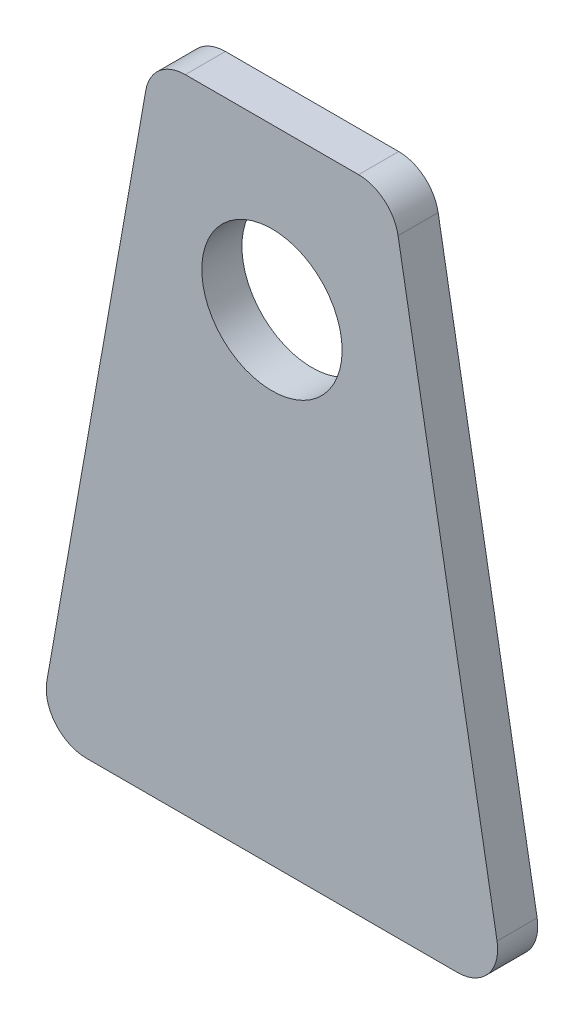
ISO-10303-21;
HEADER;
FILE_DESCRIPTION(('STEP AP214'),'2;1');
FILE_NAME('part.step','',(''),(''),'','','');
FILE_SCHEMA(('AUTOMOTIVE_DESIGN { 1 0 10303 214 1 1 1 1 }'));
ENDSEC;
DATA;
#1=APPLICATION_CONTEXT('core data for automotive mechanical design processes');
#2=APPLICATION_PROTOCOL_DEFINITION('international standard','automotive_design',2000,#1);
#3=PRODUCT_CONTEXT('',#1,'mechanical');
#4=PRODUCT('Part','Part','',(#3));
#5=PRODUCT_RELATED_PRODUCT_CATEGORY('part','',(#4));
#6=PRODUCT_DEFINITION_FORMATION('','',#4);
#7=PRODUCT_DEFINITION_CONTEXT('part definition',#1,'design');
#8=PRODUCT_DEFINITION('design','',#6,#7);
#9=PRODUCT_DEFINITION_SHAPE('','',#8);
#10=(LENGTH_UNIT() NAMED_UNIT(*) SI_UNIT(.MILLI.,.METRE.));
#11=(NAMED_UNIT(*) PLANE_ANGLE_UNIT() SI_UNIT($,.RADIAN.));
#12=(NAMED_UNIT(*) SI_UNIT($,.STERADIAN.) SOLID_ANGLE_UNIT());
#13=UNCERTAINTY_MEASURE_WITH_UNIT(LENGTH_MEASURE(1.E-05),#10,'distance_accuracy_value','');
#14=(GEOMETRIC_REPRESENTATION_CONTEXT(3) GLOBAL_UNCERTAINTY_ASSIGNED_CONTEXT((#13)) GLOBAL_UNIT_ASSIGNED_CONTEXT((#10,
#11,#12)) REPRESENTATION_CONTEXT('',''));
#15=CARTESIAN_POINT('',(0.,0.,0.));
#16=DIRECTION('',(0.,0.,1.));
#17=DIRECTION('',(1.,0.,0.));
#18=AXIS2_PLACEMENT_3D('',#15,#16,#17);
#19=CARTESIAN_POINT('',(66.3620071669862,6.35,6.35));
#20=DIRECTION('',(0.,0.,-1.));
#21=DIRECTION('',(-1.,0.,0.));
#22=AXIS2_PLACEMENT_3D('',#19,#20,#21);
#23=PLANE('',#22);
#24=CARTESIAN_POINT('',(66.3620071669862,6.35,6.35));
#25=DIRECTION('',(0.,0.,1.));
#26=DIRECTION('',(-1.,0.,0.));
#27=AXIS2_PLACEMENT_3D('',#24,#25,#26);
#28=CIRCLE('',#27,6.35);
#29=CARTESIAN_POINT('',(66.3620071669861,0.,6.35));
#30=VERTEX_POINT('',#29);
#31=CARTESIAN_POINT('',(72.6155363986137,7.45266592818504,6.35));
#32=VERTEX_POINT('',#31);
#33=EDGE_CURVE('E148',#30,#32,#28,.T.);
#34=ORIENTED_EDGE('',*,*,#33,.T.);
#35=DIRECTION('',(-0.173648177666927,0.984807753012209,0.));
#36=VECTOR('',#35,1.);
#37=CARTESIAN_POINT('',(56.9400678136315,96.3526659281849,6.35));
#38=LINE('',#37,#36);
#39=CARTESIAN_POINT('',(56.9400678136315,96.3526659281849,6.35));
#40=VERTEX_POINT('',#39);
#41=EDGE_CURVE('E96',#32,#40,#38,.T.);
#42=ORIENTED_EDGE('',*,*,#41,.T.);
#43=CARTESIAN_POINT('',(50.686538582004,95.25,6.35));
#44=DIRECTION('',(0.,0.,1.));
#45=DIRECTION('',(-1.,0.,0.));
#46=AXIS2_PLACEMENT_3D('',#43,#44,#45);
#47=CIRCLE('',#46,6.35);
#48=CARTESIAN_POINT('',(50.6865385820039,101.6,6.35));
#49=VERTEX_POINT('',#48);
#50=EDGE_CURVE('E163',#40,#49,#47,.T.);
#51=ORIENTED_EDGE('',*,*,#50,.T.);
#52=DIRECTION('',(-1.,0.,0.));
#53=VECTOR('',#52,1.);
#54=CARTESIAN_POINT('',(23.2431038979555,101.6,6.35));
#55=LINE('',#54,#53);
#56=CARTESIAN_POINT('',(23.2431038979555,101.6,6.35));
#57=VERTEX_POINT('',#56);
#58=EDGE_CURVE('E176',#49,#57,#55,.T.);
#59=ORIENTED_EDGE('',*,*,#58,.T.);
#60=CARTESIAN_POINT('',(23.2431038979555,95.25,6.35));
#61=DIRECTION('',(0.,0.,1.));
#62=DIRECTION('',(-1.,0.,0.));
#63=AXIS2_PLACEMENT_3D('',#60,#61,#62);
#64=CIRCLE('',#63,6.35);
#65=CARTESIAN_POINT('',(16.9895746663279,96.3526659281849,6.35));
#66=VERTEX_POINT('',#65);
#67=EDGE_CURVE('E115',#57,#66,#64,.T.);
#68=ORIENTED_EDGE('',*,*,#67,.T.);
#69=DIRECTION('',(-0.173648177666927,-0.984807753012209,0.));
#70=VECTOR('',#69,1.);
#71=CARTESIAN_POINT('',(1.31410608134569,7.45266592818504,6.35));
#72=LINE('',#71,#70);
#73=CARTESIAN_POINT('',(1.31410608134569,7.45266592818504,6.35));
#74=VERTEX_POINT('',#73);
#75=EDGE_CURVE('E109',#66,#74,#72,.T.);
#76=ORIENTED_EDGE('',*,*,#75,.T.);
#77=CARTESIAN_POINT('',(7.56763531297321,6.35,6.35));
#78=DIRECTION('',(0.,0.,1.));
#79=DIRECTION('',(1.,0.,0.));
#80=AXIS2_PLACEMENT_3D('',#77,#78,#79);
#81=CIRCLE('',#80,6.35);
#82=CARTESIAN_POINT('',(7.56763531297327,0.,6.35));
#83=VERTEX_POINT('',#82);
#84=EDGE_CURVE('E113',#74,#83,#81,.T.);
#85=ORIENTED_EDGE('',*,*,#84,.T.);
#86=DIRECTION('',(1.,0.,0.));
#87=VECTOR('',#86,1.);
#88=CARTESIAN_POINT('',(7.56763531297327,0.,6.35));
#89=LINE('',#88,#87);
#90=EDGE_CURVE('E53',#83,#30,#89,.T.);
#91=ORIENTED_EDGE('',*,*,#90,.T.);
#92=EDGE_LOOP('',(#34,#42,#51,#59,#68,#76,#85,#91));
#93=FACE_BOUND('',#92,.T.);
#94=CARTESIAN_POINT('',(36.9648212399797,76.2,6.35));
#95=DIRECTION('',(0.,0.,1.));
#96=DIRECTION('',(1.,0.,0.));
#97=AXIS2_PLACEMENT_3D('',#94,#95,#96);
#98=CIRCLE('',#97,11.1125);
#99=CARTESIAN_POINT('',(48.0773212399797,76.2,6.35));
#100=VERTEX_POINT('',#99);
#101=EDGE_CURVE('E137',#100,#100,#98,.T.);
#102=ORIENTED_EDGE('',*,*,#101,.F.);
#103=EDGE_LOOP('',(#102));
#104=FACE_BOUND('',#103,.T.);
#105=ADVANCED_FACE('F36',(#93,#104),#23,.F.);
#106=CARTESIAN_POINT('',(66.3620071669862,6.35,0.));
#107=DIRECTION('',(0.,0.,-1.));
#108=DIRECTION('',(-1.,0.,0.));
#109=AXIS2_PLACEMENT_3D('',#106,#107,#108);
#110=PLANE('',#109);
#111=CARTESIAN_POINT('',(66.3620071669862,6.35,0.));
#112=DIRECTION('',(0.,0.,1.));
#113=DIRECTION('',(-1.,0.,0.));
#114=AXIS2_PLACEMENT_3D('',#111,#112,#113);
#115=CIRCLE('',#114,6.35);
#116=CARTESIAN_POINT('',(66.3620071669861,0.,0.));
#117=VERTEX_POINT('',#116);
#118=CARTESIAN_POINT('',(72.6155363986137,7.45266592818504,0.));
#119=VERTEX_POINT('',#118);
#120=EDGE_CURVE('E133',#117,#119,#115,.T.);
#121=ORIENTED_EDGE('',*,*,#120,.F.);
#122=DIRECTION('',(1.,0.,0.));
#123=VECTOR('',#122,1.);
#124=CARTESIAN_POINT('',(7.56763531297327,0.,0.));
#125=LINE('',#124,#123);
#126=CARTESIAN_POINT('',(7.56763531297327,0.,0.));
#127=VERTEX_POINT('',#126);
#128=EDGE_CURVE('E88',#127,#117,#125,.T.);
#129=ORIENTED_EDGE('',*,*,#128,.F.);
#130=CARTESIAN_POINT('',(7.56763531297321,6.35,0.));
#131=DIRECTION('',(0.,0.,1.));
#132=DIRECTION('',(1.,0.,0.));
#133=AXIS2_PLACEMENT_3D('',#130,#131,#132);
#134=CIRCLE('',#133,6.35);
#135=CARTESIAN_POINT('',(1.31410608134569,7.45266592818504,0.));
#136=VERTEX_POINT('',#135);
#137=EDGE_CURVE('E82',#136,#127,#134,.T.);
#138=ORIENTED_EDGE('',*,*,#137,.F.);
#139=DIRECTION('',(-0.173648177666927,-0.984807753012209,0.));
#140=VECTOR('',#139,1.);
#141=CARTESIAN_POINT('',(1.31410608134569,7.45266592818504,0.));
#142=LINE('',#141,#140);
#143=CARTESIAN_POINT('',(16.9895746663279,96.3526659281849,0.));
#144=VERTEX_POINT('',#143);
#145=EDGE_CURVE('E123',#144,#136,#142,.T.);
#146=ORIENTED_EDGE('',*,*,#145,.F.);
#147=CARTESIAN_POINT('',(23.2431038979555,95.25,0.));
#148=DIRECTION('',(0.,0.,1.));
#149=DIRECTION('',(-1.,0.,0.));
#150=AXIS2_PLACEMENT_3D('',#147,#148,#149);
#151=CIRCLE('',#150,6.35);
#152=CARTESIAN_POINT('',(23.2431038979555,101.6,0.));
#153=VERTEX_POINT('',#152);
#154=EDGE_CURVE('E143',#153,#144,#151,.T.);
#155=ORIENTED_EDGE('',*,*,#154,.F.);
#156=DIRECTION('',(-1.,0.,0.));
#157=VECTOR('',#156,1.);
#158=CARTESIAN_POINT('',(23.2431038979555,101.6,0.));
#159=LINE('',#158,#157);
#160=CARTESIAN_POINT('',(50.6865385820039,101.6,0.));
#161=VERTEX_POINT('',#160);
#162=EDGE_CURVE('E141',#161,#153,#159,.T.);
#163=ORIENTED_EDGE('',*,*,#162,.F.);
#164=CARTESIAN_POINT('',(50.686538582004,95.25,0.));
#165=DIRECTION('',(0.,0.,1.));
#166=DIRECTION('',(-1.,0.,0.));
#167=AXIS2_PLACEMENT_3D('',#164,#165,#166);
#168=CIRCLE('',#167,6.35);
#169=CARTESIAN_POINT('',(56.9400678136315,96.3526659281849,0.));
#170=VERTEX_POINT('',#169);
#171=EDGE_CURVE('E139',#170,#161,#168,.T.);
#172=ORIENTED_EDGE('',*,*,#171,.F.);
#173=DIRECTION('',(-0.173648177666927,0.984807753012209,0.));
#174=VECTOR('',#173,1.);
#175=CARTESIAN_POINT('',(56.9400678136315,96.3526659281849,0.));
#176=LINE('',#175,#174);
#177=EDGE_CURVE('E136',#119,#170,#176,.T.);
#178=ORIENTED_EDGE('',*,*,#177,.F.);
#179=EDGE_LOOP('',(#121,#129,#138,#146,#155,#163,#172,#178));
#180=FACE_BOUND('',#179,.T.);
#181=CARTESIAN_POINT('',(36.9648212399797,76.2,0.));
#182=DIRECTION('',(0.,0.,1.));
#183=DIRECTION('',(1.,0.,0.));
#184=AXIS2_PLACEMENT_3D('',#181,#182,#183);
#185=CIRCLE('',#184,11.1125);
#186=CARTESIAN_POINT('',(48.0773212399797,76.2,0.));
#187=VERTEX_POINT('',#186);
#188=EDGE_CURVE('E182',#187,#187,#185,.T.);
#189=ORIENTED_EDGE('',*,*,#188,.T.);
#190=EDGE_LOOP('',(#189));
#191=FACE_BOUND('',#190,.T.);
#192=ADVANCED_FACE('F167',(#180,#191),#110,.T.);
#193=CARTESIAN_POINT('',(66.3620071669862,6.35,6.35));
#194=DIRECTION('',(0.,0.,-1.));
#195=DIRECTION('',(-1.,0.,0.));
#196=AXIS2_PLACEMENT_3D('',#193,#194,#195);
#197=CYLINDRICAL_SURFACE('',#196,6.35);
#198=ORIENTED_EDGE('',*,*,#120,.T.);
#199=DIRECTION('',(0.,0.,-1.));
#200=VECTOR('',#199,1.);
#201=CARTESIAN_POINT('',(72.6155363986137,7.45266592818504,6.35));
#202=LINE('',#201,#200);
#203=EDGE_CURVE('E11',#32,#119,#202,.T.);
#204=ORIENTED_EDGE('',*,*,#203,.F.);
#205=ORIENTED_EDGE('',*,*,#33,.F.);
#206=DIRECTION('',(0.,0.,-1.));
#207=VECTOR('',#206,1.);
#208=CARTESIAN_POINT('',(66.3620071669861,0.,6.35));
#209=LINE('',#208,#207);
#210=EDGE_CURVE('E129',#30,#117,#209,.T.);
#211=ORIENTED_EDGE('',*,*,#210,.T.);
#212=EDGE_LOOP('',(#198,#204,#205,#211));
#213=FACE_BOUND('',#212,.T.);
#214=ADVANCED_FACE('F38',(#213),#197,.T.);
#215=CARTESIAN_POINT('',(56.9400678136315,96.3526659281849,6.35));
#216=DIRECTION('',(-0.984807753012209,-0.173648177666927,0.));
#217=DIRECTION('',(0.173648177666927,-0.984807753012209,0.));
#218=AXIS2_PLACEMENT_3D('',#215,#216,#217);
#219=PLANE('',#218);
#220=ORIENTED_EDGE('',*,*,#177,.T.);
#221=DIRECTION('',(0.,0.,-1.));
#222=VECTOR('',#221,1.);
#223=CARTESIAN_POINT('',(56.9400678136315,96.3526659281849,6.35));
#224=LINE('',#223,#222);
#225=EDGE_CURVE('E45',#40,#170,#224,.T.);
#226=ORIENTED_EDGE('',*,*,#225,.F.);
#227=ORIENTED_EDGE('',*,*,#41,.F.);
#228=ORIENTED_EDGE('',*,*,#203,.T.);
#229=EDGE_LOOP('',(#220,#226,#227,#228));
#230=FACE_BOUND('',#229,.T.);
#231=ADVANCED_FACE('F210',(#230),#219,.F.);
#232=CARTESIAN_POINT('',(50.686538582004,95.25,6.35));
#233=DIRECTION('',(0.,0.,-1.));
#234=DIRECTION('',(-1.,0.,0.));
#235=AXIS2_PLACEMENT_3D('',#232,#233,#234);
#236=CYLINDRICAL_SURFACE('',#235,6.35);
#237=ORIENTED_EDGE('',*,*,#171,.T.);
#238=DIRECTION('',(0.,0.,-1.));
#239=VECTOR('',#238,1.);
#240=CARTESIAN_POINT('',(50.6865385820039,101.6,6.35));
#241=LINE('',#240,#239);
#242=EDGE_CURVE('E155',#49,#161,#241,.T.);
#243=ORIENTED_EDGE('',*,*,#242,.F.);
#244=ORIENTED_EDGE('',*,*,#50,.F.);
#245=ORIENTED_EDGE('',*,*,#225,.T.);
#246=EDGE_LOOP('',(#237,#243,#244,#245));
#247=FACE_BOUND('',#246,.T.);
#248=ADVANCED_FACE('F161',(#247),#236,.T.);
#249=CARTESIAN_POINT('',(23.2431038979555,101.6,6.35));
#250=DIRECTION('',(0.,-1.,0.));
#251=DIRECTION('',(1.,0.,0.));
#252=AXIS2_PLACEMENT_3D('',#249,#250,#251);
#253=PLANE('',#252);
#254=ORIENTED_EDGE('',*,*,#162,.T.);
#255=DIRECTION('',(0.,0.,-1.));
#256=VECTOR('',#255,1.);
#257=CARTESIAN_POINT('',(23.2431038979555,101.6,6.35));
#258=LINE('',#257,#256);
#259=EDGE_CURVE('E152',#57,#153,#258,.T.);
#260=ORIENTED_EDGE('',*,*,#259,.F.);
#261=ORIENTED_EDGE('',*,*,#58,.F.);
#262=ORIENTED_EDGE('',*,*,#242,.T.);
#263=EDGE_LOOP('',(#254,#260,#261,#262));
#264=FACE_BOUND('',#263,.T.);
#265=ADVANCED_FACE('F172',(#264),#253,.F.);
#266=CARTESIAN_POINT('',(23.2431038979555,95.25,6.35));
#267=DIRECTION('',(0.,0.,-1.));
#268=DIRECTION('',(-1.,0.,0.));
#269=AXIS2_PLACEMENT_3D('',#266,#267,#268);
#270=CYLINDRICAL_SURFACE('',#269,6.35);
#271=ORIENTED_EDGE('',*,*,#154,.T.);
#272=DIRECTION('',(0.,0.,-1.));
#273=VECTOR('',#272,1.);
#274=CARTESIAN_POINT('',(16.9895746663279,96.3526659281849,6.35));
#275=LINE('',#274,#273);
#276=EDGE_CURVE('E124',#66,#144,#275,.T.);
#277=ORIENTED_EDGE('',*,*,#276,.F.);
#278=ORIENTED_EDGE('',*,*,#67,.F.);
#279=ORIENTED_EDGE('',*,*,#259,.T.);
#280=EDGE_LOOP('',(#271,#277,#278,#279));
#281=FACE_BOUND('',#280,.T.);
#282=ADVANCED_FACE('F175',(#281),#270,.T.);
#283=CARTESIAN_POINT('',(1.31410608134569,7.45266592818504,6.35));
#284=DIRECTION('',(0.984807753012209,-0.173648177666927,0.));
#285=DIRECTION('',(0.173648177666927,0.984807753012209,0.));
#286=AXIS2_PLACEMENT_3D('',#283,#284,#285);
#287=PLANE('',#286);
#288=ORIENTED_EDGE('',*,*,#145,.T.);
#289=DIRECTION('',(0.,0.,-1.));
#290=VECTOR('',#289,1.);
#291=CARTESIAN_POINT('',(1.31410608134569,7.45266592818504,6.35));
#292=LINE('',#291,#290);
#293=EDGE_CURVE('E120',#74,#136,#292,.T.);
#294=ORIENTED_EDGE('',*,*,#293,.F.);
#295=ORIENTED_EDGE('',*,*,#75,.F.);
#296=ORIENTED_EDGE('',*,*,#276,.T.);
#297=EDGE_LOOP('',(#288,#294,#295,#296));
#298=FACE_BOUND('',#297,.T.);
#299=ADVANCED_FACE('F121',(#298),#287,.F.);
#300=CARTESIAN_POINT('',(7.56763531297321,6.35,6.35));
#301=DIRECTION('',(0.,0.,-1.));
#302=DIRECTION('',(-1.,0.,0.));
#303=AXIS2_PLACEMENT_3D('',#300,#301,#302);
#304=CYLINDRICAL_SURFACE('',#303,6.35);
#305=ORIENTED_EDGE('',*,*,#137,.T.);
#306=DIRECTION('',(0.,0.,-1.));
#307=VECTOR('',#306,1.);
#308=CARTESIAN_POINT('',(7.56763531297327,0.,6.35));
#309=LINE('',#308,#307);
#310=EDGE_CURVE('E125',#83,#127,#309,.T.);
#311=ORIENTED_EDGE('',*,*,#310,.F.);
#312=ORIENTED_EDGE('',*,*,#84,.F.);
#313=ORIENTED_EDGE('',*,*,#293,.T.);
#314=EDGE_LOOP('',(#305,#311,#312,#313));
#315=FACE_BOUND('',#314,.T.);
#316=ADVANCED_FACE('F127',(#315),#304,.T.);
#317=CARTESIAN_POINT('',(7.56763531297327,0.,6.35));
#318=DIRECTION('',(0.,1.,0.));
#319=DIRECTION('',(-1.,0.,0.));
#320=AXIS2_PLACEMENT_3D('',#317,#318,#319);
#321=PLANE('',#320);
#322=ORIENTED_EDGE('',*,*,#128,.T.);
#323=ORIENTED_EDGE('',*,*,#210,.F.);
#324=ORIENTED_EDGE('',*,*,#90,.F.);
#325=ORIENTED_EDGE('',*,*,#310,.T.);
#326=EDGE_LOOP('',(#322,#323,#324,#325));
#327=FACE_BOUND('',#326,.T.);
#328=ADVANCED_FACE('F198',(#327),#321,.F.);
#329=CARTESIAN_POINT('',(36.9648212399797,76.2,6.35));
#330=DIRECTION('',(0.,0.,-1.));
#331=DIRECTION('',(-1.,0.,0.));
#332=AXIS2_PLACEMENT_3D('',#329,#330,#331);
#333=CYLINDRICAL_SURFACE('',#332,11.1125);
#334=ORIENTED_EDGE('',*,*,#101,.T.);
#335=EDGE_LOOP('',(#334));
#336=FACE_BOUND('',#335,.T.);
#337=ORIENTED_EDGE('',*,*,#188,.F.);
#338=EDGE_LOOP('',(#337));
#339=FACE_BOUND('',#338,.T.);
#340=ADVANCED_FACE('F188',(#336,#339),#333,.F.);
#341=CLOSED_SHELL('',(#105,#192,#214,#231,#248,#265,#282,#299,#316,#328,#340));
#342=MANIFOLD_SOLID_BREP('B2',#341);
#343=ADVANCED_BREP_SHAPE_REPRESENTATION('',(#18,#342),#14);
#344=SHAPE_DEFINITION_REPRESENTATION(#9,#343);
ENDSEC;
END-ISO-10303-21;
